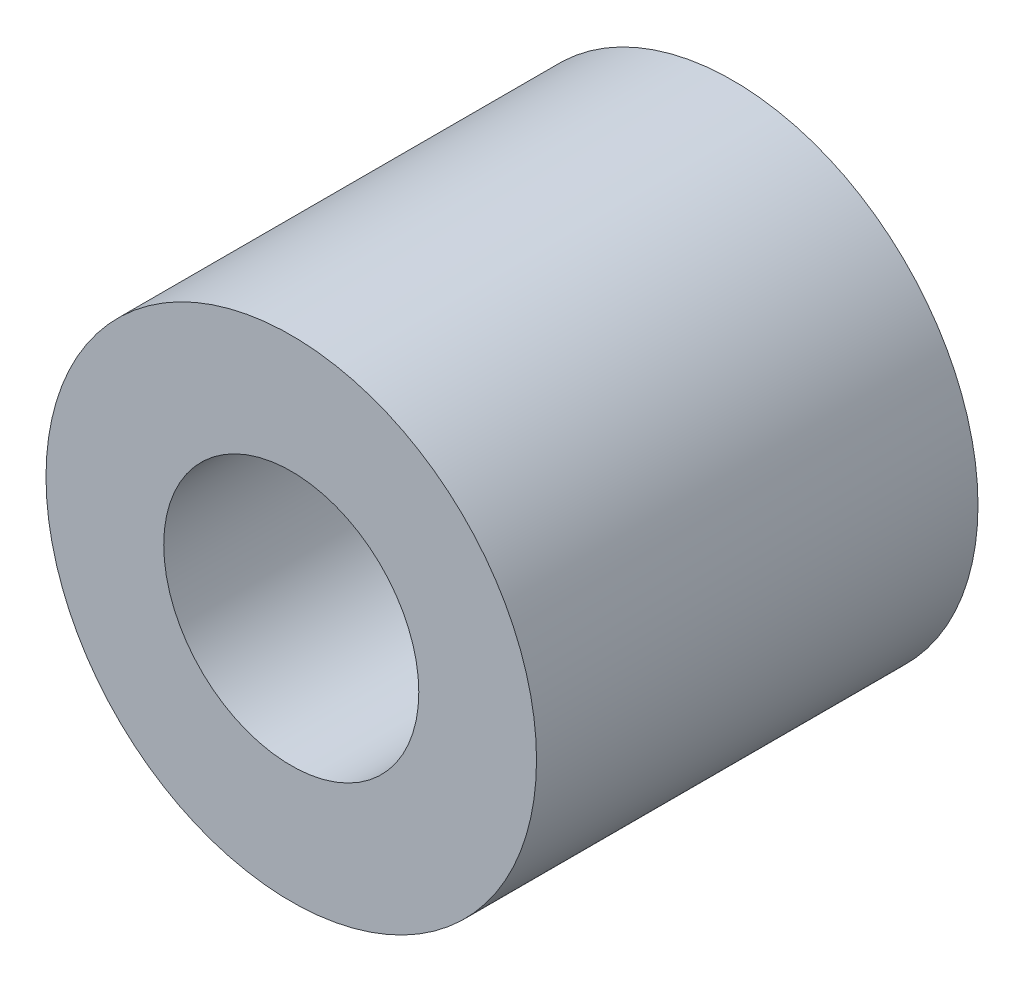
ISO-10303-21;
HEADER;
FILE_DESCRIPTION(('STEP AP214'),'2;1');
FILE_NAME('part.step','',(''),(''),'','','');
FILE_SCHEMA(('AUTOMOTIVE_DESIGN { 1 0 10303 214 1 1 1 1 }'));
ENDSEC;
DATA;
#1=APPLICATION_CONTEXT('core data for automotive mechanical design processes');
#2=APPLICATION_PROTOCOL_DEFINITION('international standard','automotive_design',2000,#1);
#3=PRODUCT_CONTEXT('',#1,'mechanical');
#4=PRODUCT('Part','Part','',(#3));
#5=PRODUCT_RELATED_PRODUCT_CATEGORY('part','',(#4));
#6=PRODUCT_DEFINITION_FORMATION('','',#4);
#7=PRODUCT_DEFINITION_CONTEXT('part definition',#1,'design');
#8=PRODUCT_DEFINITION('design','',#6,#7);
#9=PRODUCT_DEFINITION_SHAPE('','',#8);
#10=(LENGTH_UNIT() NAMED_UNIT(*) SI_UNIT(.MILLI.,.METRE.));
#11=(NAMED_UNIT(*) PLANE_ANGLE_UNIT() SI_UNIT($,.RADIAN.));
#12=(NAMED_UNIT(*) SI_UNIT($,.STERADIAN.) SOLID_ANGLE_UNIT());
#13=UNCERTAINTY_MEASURE_WITH_UNIT(LENGTH_MEASURE(1.E-05),#10,'distance_accuracy_value','');
#14=(GEOMETRIC_REPRESENTATION_CONTEXT(3) GLOBAL_UNCERTAINTY_ASSIGNED_CONTEXT((#13)) GLOBAL_UNIT_ASSIGNED_CONTEXT((#10,
#11,#12)) REPRESENTATION_CONTEXT('',''));
#15=CARTESIAN_POINT('',(0.,0.,0.));
#16=DIRECTION('',(0.,0.,1.));
#17=DIRECTION('',(1.,0.,0.));
#18=AXIS2_PLACEMENT_3D('',#15,#16,#17);
#19=CARTESIAN_POINT('',(0.,0.,11.43));
#20=DIRECTION('',(0.,0.,1.));
#21=DIRECTION('',(1.,0.,0.));
#22=AXIS2_PLACEMENT_3D('',#19,#20,#21);
#23=PLANE('',#22);
#24=CARTESIAN_POINT('',(0.,0.,11.43));
#25=DIRECTION('',(0.,0.,1.));
#26=DIRECTION('',(1.,0.,0.));
#27=AXIS2_PLACEMENT_3D('',#24,#25,#26);
#28=CIRCLE('',#27,6.35);
#29=CARTESIAN_POINT('',(6.35,0.,11.43));
#30=VERTEX_POINT('',#29);
#31=EDGE_CURVE('E10',#30,#30,#28,.T.);
#32=ORIENTED_EDGE('',*,*,#31,.T.);
#33=EDGE_LOOP('',(#32));
#34=FACE_BOUND('',#33,.T.);
#35=CARTESIAN_POINT('',(0.,0.,11.43));
#36=DIRECTION('',(0.,0.,1.));
#37=DIRECTION('',(1.,0.,0.));
#38=AXIS2_PLACEMENT_3D('',#35,#36,#37);
#39=CIRCLE('',#38,3.302);
#40=CARTESIAN_POINT('',(3.302,0.,11.43));
#41=VERTEX_POINT('',#40);
#42=EDGE_CURVE('E46',#41,#41,#39,.T.);
#43=ORIENTED_EDGE('',*,*,#42,.F.);
#44=EDGE_LOOP('',(#43));
#45=FACE_BOUND('',#44,.T.);
#46=ADVANCED_FACE('F35',(#34,#45),#23,.T.);
#47=CARTESIAN_POINT('',(0.,0.,0.));
#48=DIRECTION('',(0.,0.,1.));
#49=DIRECTION('',(1.,0.,0.));
#50=AXIS2_PLACEMENT_3D('',#47,#48,#49);
#51=PLANE('',#50);
#52=CARTESIAN_POINT('',(0.,0.,0.));
#53=DIRECTION('',(0.,0.,1.));
#54=DIRECTION('',(1.,0.,0.));
#55=AXIS2_PLACEMENT_3D('',#52,#53,#54);
#56=CIRCLE('',#55,6.35);
#57=CARTESIAN_POINT('',(6.35,0.,0.));
#58=VERTEX_POINT('',#57);
#59=EDGE_CURVE('E39',#58,#58,#56,.T.);
#60=ORIENTED_EDGE('',*,*,#59,.F.);
#61=EDGE_LOOP('',(#60));
#62=FACE_BOUND('',#61,.T.);
#63=CARTESIAN_POINT('',(0.,0.,0.));
#64=DIRECTION('',(0.,0.,1.));
#65=DIRECTION('',(1.,0.,0.));
#66=AXIS2_PLACEMENT_3D('',#63,#64,#65);
#67=CIRCLE('',#66,3.302);
#68=CARTESIAN_POINT('',(3.302,0.,0.));
#69=VERTEX_POINT('',#68);
#70=EDGE_CURVE('E48',#69,#69,#67,.T.);
#71=ORIENTED_EDGE('',*,*,#70,.T.);
#72=EDGE_LOOP('',(#71));
#73=FACE_BOUND('',#72,.T.);
#74=ADVANCED_FACE('F58',(#62,#73),#51,.F.);
#75=CARTESIAN_POINT('',(0.,0.,11.43));
#76=DIRECTION('',(0.,0.,-1.));
#77=DIRECTION('',(-1.,0.,0.));
#78=AXIS2_PLACEMENT_3D('',#75,#76,#77);
#79=CYLINDRICAL_SURFACE('',#78,6.35);
#80=ORIENTED_EDGE('',*,*,#31,.F.);
#81=EDGE_LOOP('',(#80));
#82=FACE_BOUND('',#81,.T.);
#83=ORIENTED_EDGE('',*,*,#59,.T.);
#84=EDGE_LOOP('',(#83));
#85=FACE_BOUND('',#84,.T.);
#86=ADVANCED_FACE('F37',(#82,#85),#79,.T.);
#87=CARTESIAN_POINT('',(0.,0.,11.43));
#88=DIRECTION('',(0.,0.,-1.));
#89=DIRECTION('',(-1.,0.,0.));
#90=AXIS2_PLACEMENT_3D('',#87,#88,#89);
#91=CYLINDRICAL_SURFACE('',#90,3.302);
#92=ORIENTED_EDGE('',*,*,#42,.T.);
#93=EDGE_LOOP('',(#92));
#94=FACE_BOUND('',#93,.T.);
#95=ORIENTED_EDGE('',*,*,#70,.F.);
#96=EDGE_LOOP('',(#95));
#97=FACE_BOUND('',#96,.T.);
#98=ADVANCED_FACE('F54',(#94,#97),#91,.F.);
#99=CLOSED_SHELL('',(#46,#74,#86,#98));
#100=MANIFOLD_SOLID_BREP('B2',#99);
#101=ADVANCED_BREP_SHAPE_REPRESENTATION('',(#18,#100),#14);
#102=SHAPE_DEFINITION_REPRESENTATION(#9,#101);
ENDSEC;
END-ISO-10303-21;
